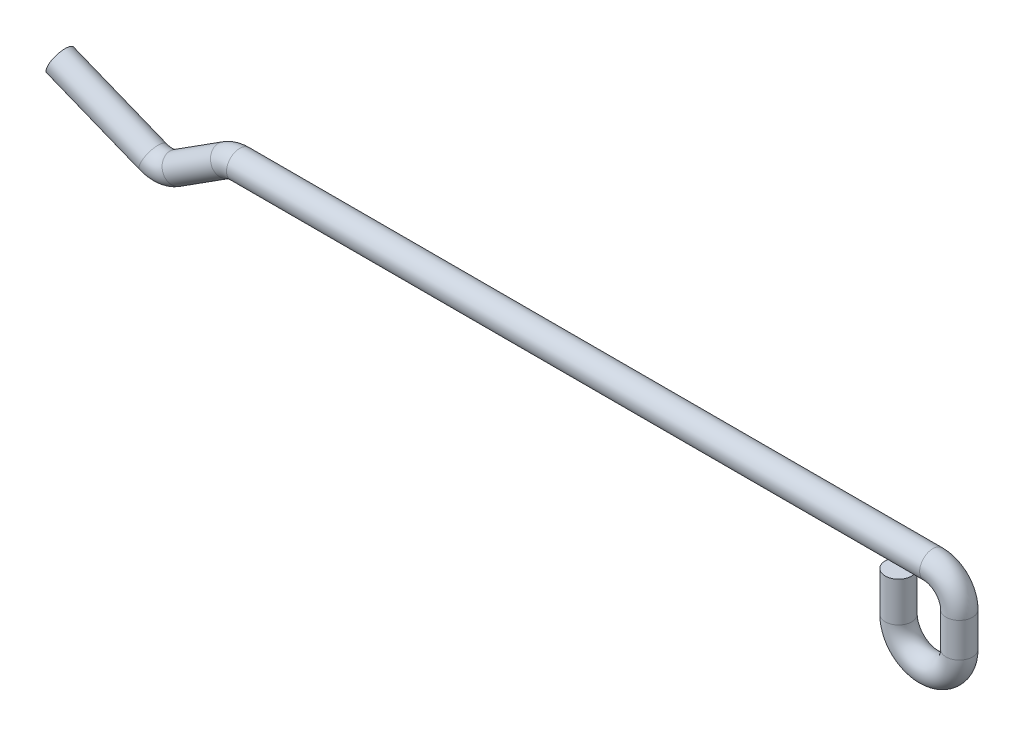
ISO-10303-21;
HEADER;
FILE_DESCRIPTION(('STEP AP214'),'2;1');
FILE_NAME('part.step','',(''),(''),'','','');
FILE_SCHEMA(('AUTOMOTIVE_DESIGN { 1 0 10303 214 1 1 1 1 }'));
ENDSEC;
DATA;
#1=APPLICATION_CONTEXT('core data for automotive mechanical design processes');
#2=APPLICATION_PROTOCOL_DEFINITION('international standard','automotive_design',2000,#1);
#3=PRODUCT_CONTEXT('',#1,'mechanical');
#4=PRODUCT('Part','Part','',(#3));
#5=PRODUCT_RELATED_PRODUCT_CATEGORY('part','',(#4));
#6=PRODUCT_DEFINITION_FORMATION('','',#4);
#7=PRODUCT_DEFINITION_CONTEXT('part definition',#1,'design');
#8=PRODUCT_DEFINITION('design','',#6,#7);
#9=PRODUCT_DEFINITION_SHAPE('','',#8);
#10=(LENGTH_UNIT() NAMED_UNIT(*) SI_UNIT(.MILLI.,.METRE.));
#11=(NAMED_UNIT(*) PLANE_ANGLE_UNIT() SI_UNIT($,.RADIAN.));
#12=(NAMED_UNIT(*) SI_UNIT($,.STERADIAN.) SOLID_ANGLE_UNIT());
#13=UNCERTAINTY_MEASURE_WITH_UNIT(LENGTH_MEASURE(1.E-05),#10,'distance_accuracy_value','');
#14=(GEOMETRIC_REPRESENTATION_CONTEXT(3) GLOBAL_UNCERTAINTY_ASSIGNED_CONTEXT((#13)) GLOBAL_UNIT_ASSIGNED_CONTEXT((#10,
#11,#12)) REPRESENTATION_CONTEXT('',''));
#15=CARTESIAN_POINT('',(0.,0.,0.));
#16=DIRECTION('',(0.,0.,1.));
#17=DIRECTION('',(1.,0.,0.));
#18=AXIS2_PLACEMENT_3D('',#15,#16,#17);
#19=CARTESIAN_POINT('',(-56.3710232392201,-1.2177613136877,0.));
#20=DIRECTION('',(-0.928195443882563,0.372093023255814,0.));
#21=DIRECTION('',(-0.372093023255814,-0.928195443882563,0.));
#22=AXIS2_PLACEMENT_3D('',#19,#20,#21);
#23=CYLINDRICAL_SURFACE('',#22,1.);
#24=CARTESIAN_POINT('',(-56.3710232392201,-1.2177613136877,0.));
#25=DIRECTION('',(0.928195443882568,-0.372093023255802,0.));
#26=DIRECTION('',(0.,0.,1.));
#27=AXIS2_PLACEMENT_3D('',#24,#25,#26);
#28=CIRCLE('',#27,1.);
#29=CARTESIAN_POINT('',(-56.7431162624759,-2.14595675757027,0.));
#30=VERTEX_POINT('',#29);
#31=EDGE_CURVE('E40',#30,#30,#28,.T.);
#32=CARTESIAN_POINT('',(-63.4,1.6,0.));
#33=DIRECTION('',(0.928195443882568,-0.372093023255802,0.));
#34=DIRECTION('',(0.,0.,1.));
#35=AXIS2_PLACEMENT_3D('',#32,#33,#34);
#36=CIRCLE('',#35,1.);
#37=CARTESIAN_POINT('',(-63.7720930232558,0.671804556117432,0.));
#38=VERTEX_POINT('',#37);
#39=EDGE_CURVE('E10',#38,#38,#36,.T.);
#40=CARTESIAN_POINT('',(-56.7431162624759,-2.14595675757027,0.));
#41=CARTESIAN_POINT('',(-56.8163347704007,-2.11660507721935,0.));
#42=CARTESIAN_POINT('',(-56.8895532783255,-2.08725339686844,0.));
#43=CARTESIAN_POINT('',(-57.0359902941751,-2.02855003616661,0.));
#44=CARTESIAN_POINT('',(-57.1092088020998,-1.9991983558157,0.));
#45=CARTESIAN_POINT('',(-57.2556458179494,-1.94049499511387,0.));
#46=CARTESIAN_POINT('',(-57.3288643258742,-1.91114331476296,0.));
#47=CARTESIAN_POINT('',(-57.4753013417238,-1.85243995406113,0.));
#48=CARTESIAN_POINT('',(-57.5485198496486,-1.82308827371022,0.));
#49=CARTESIAN_POINT('',(-57.6949568654982,-1.76438491300839,0.));
#50=CARTESIAN_POINT('',(-57.768175373423,-1.73503323265748,0.));
#51=CARTESIAN_POINT('',(-57.9146123892726,-1.67632987195565,0.));
#52=CARTESIAN_POINT('',(-57.9878308971973,-1.64697819160474,0.));
#53=CARTESIAN_POINT('',(-58.1342679130469,-1.58827483090291,0.));
#54=CARTESIAN_POINT('',(-58.2074864209717,-1.55892315055199,0.));
#55=CARTESIAN_POINT('',(-58.3539234368213,-1.50021978985017,0.));
#56=CARTESIAN_POINT('',(-58.4271419447461,-1.47086810949926,0.));
#57=CARTESIAN_POINT('',(-58.5735789605957,-1.41216474879743,0.));
#58=CARTESIAN_POINT('',(-58.6467974685205,-1.38281306844651,0.));
#59=CARTESIAN_POINT('',(-58.79323448437,-1.32410970774469,0.));
#60=CARTESIAN_POINT('',(-58.8664529922948,-1.29475802739377,0.));
#61=CARTESIAN_POINT('',(-59.0128900081444,-1.23605466669195,0.));
#62=CARTESIAN_POINT('',(-59.0861085160692,-1.20670298634103,0.));
#63=CARTESIAN_POINT('',(-59.2325455319188,-1.14799962563921,0.));
#64=CARTESIAN_POINT('',(-59.3057640398436,-1.11864794528829,0.));
#65=CARTESIAN_POINT('',(-59.4522010556932,-1.05994458458647,0.));
#66=CARTESIAN_POINT('',(-59.525419563618,-1.03059290423555,0.));
#67=CARTESIAN_POINT('',(-59.6718565794675,-0.971889543533725,0.));
#68=CARTESIAN_POINT('',(-59.7450750873923,-0.942537863182811,0.));
#69=CARTESIAN_POINT('',(-59.8915121032419,-0.883834502480984,0.));
#70=CARTESIAN_POINT('',(-59.9647306111667,-0.854482822130071,0.));
#71=CARTESIAN_POINT('',(-60.1111676270163,-0.795779461428244,0.));
#72=CARTESIAN_POINT('',(-60.1843861349411,-0.76642778107733,0.));
#73=CARTESIAN_POINT('',(-60.3308231507907,-0.707724420375503,0.));
#74=CARTESIAN_POINT('',(-60.4040416587154,-0.67837274002459,0.));
#75=CARTESIAN_POINT('',(-60.550478674565,-0.619669379322764,0.));
#76=CARTESIAN_POINT('',(-60.6236971824898,-0.590317698971849,0.));
#77=CARTESIAN_POINT('',(-60.7701341983394,-0.531614338270022,0.));
#78=CARTESIAN_POINT('',(-60.8433527062642,-0.502262657919108,0.));
#79=CARTESIAN_POINT('',(-60.9897897221138,-0.443559297217282,0.));
#80=CARTESIAN_POINT('',(-61.0630082300386,-0.414207616866369,0.));
#81=CARTESIAN_POINT('',(-61.2094452458882,-0.355504256164542,0.));
#82=CARTESIAN_POINT('',(-61.2826637538129,-0.326152575813627,0.));
#83=CARTESIAN_POINT('',(-61.4291007696625,-0.2674492151118,0.));
#84=CARTESIAN_POINT('',(-61.5023192775873,-0.238097534760888,0.));
#85=CARTESIAN_POINT('',(-61.6487562934369,-0.179394174059061,0.));
#86=CARTESIAN_POINT('',(-61.7219748013617,-0.150042493708146,0.));
#87=CARTESIAN_POINT('',(-61.8684118172113,-0.0913391330063192,0.));
#88=CARTESIAN_POINT('',(-61.9416303251361,-0.0619874526554063,0.));
#89=CARTESIAN_POINT('',(-62.0880673409856,-0.00328409195357959,0.));
#90=CARTESIAN_POINT('',(-62.1612858489104,0.0260675883973342,0.));
#91=CARTESIAN_POINT('',(-62.30772286476,0.0847709490991613,0.));
#92=CARTESIAN_POINT('',(-62.3809413726848,0.114122629450075,0.));
#93=CARTESIAN_POINT('',(-62.5273783885344,0.172825990151902,0.));
#94=CARTESIAN_POINT('',(-62.6005968964592,0.202177670502817,0.));
#95=CARTESIAN_POINT('',(-62.7470339123088,0.260881031204643,0.));
#96=CARTESIAN_POINT('',(-62.8202524202336,0.290232711555555,0.));
#97=CARTESIAN_POINT('',(-62.9666894360831,0.348936072257382,0.));
#98=CARTESIAN_POINT('',(-63.0399079440079,0.378287752608296,0.));
#99=CARTESIAN_POINT('',(-63.1863449598575,0.436991113310124,0.));
#100=CARTESIAN_POINT('',(-63.2595634677823,0.466342793661037,0.));
#101=CARTESIAN_POINT('',(-63.4060004836319,0.525046154362864,0.));
#102=CARTESIAN_POINT('',(-63.4792189915567,0.554397834713778,0.));
#103=CARTESIAN_POINT('',(-63.6256560074062,0.613101195415605,0.));
#104=CARTESIAN_POINT('',(-63.698874515331,0.642452875766518,0.));
#105=CARTESIAN_POINT('',(-63.7720930232558,0.671804556117432,0.));
#106=B_SPLINE_CURVE_WITH_KNOTS('',3,(#40,#41,#42,#43,#44,#45,#46,#47,#48,#49,#50,#51,#52,#53,
#54,#55,#56,#57,#58,#59,#60,#61,#62,#63,#64,#65,#66,#67,#68,#69,#70,#71,#72,#73,#74,#75,#76,#77,
#78,#79,#80,#81,#82,#83,#84,#85,#86,#87,#88,#89,#90,#91,#92,#93,#94,#95,#96,#97,#98,#99,#100,
#101,#102,#103,#104,#105),.UNSPECIFIED.,.F.,.F.,(4,2,2,2,2,2,2,2,2,2,2,2,2,2,2,2,2,2,2,2,2,2,2,
2,2,2,2,2,2,2,2,2,4),(0.,0.236647922829238,0.473295845658475,0.709943768487719,
0.946591691316957,1.1832396141462,1.41988753697544,1.65653545980468,1.89318338263392,
2.12983130546316,2.3664792282924,2.60312715112164,2.83977507395088,3.07642299678012,
3.31307091960936,3.5497188424386,3.78636676526784,4.02301468809708,4.25966261092632,
4.49631053375556,4.7329584565848,4.96960637941404,5.20625430224328,5.44290222507252,
5.67955014790176,5.916198070731,6.15284599356024,6.38949391638948,6.62614183921873,
6.86278976204797,7.0994376848772,7.33608560770644,7.57273353053568),.UNSPECIFIED.);
#107=EDGE_CURVE('BSEAM34',#30,#38,#106,.T.);
#108=ORIENTED_EDGE('',*,*,#31,.F.);
#109=ORIENTED_EDGE('',*,*,#39,.T.);
#110=ORIENTED_EDGE('',*,*,#107,.T.);
#111=ORIENTED_EDGE('',*,*,#107,.F.);
#112=EDGE_LOOP('',(#108,#110,#109,#111));
#113=FACE_BOUND('',#112,.T.);
#114=ADVANCED_FACE('F34',(#113),#23,.T.);
#115=CARTESIAN_POINT('',(-55.6268371927084,0.638629574077423,0.));
#116=DIRECTION('',(0.,0.,-1.));
#117=DIRECTION('',(-1.,0.,0.));
#118=AXIS2_PLACEMENT_3D('',#115,#116,#117);
#119=TOROIDAL_SURFACE('',#118,2.,1.);
#120=CARTESIAN_POINT('',(-54.5514043560066,-1.04762195334767,0.));
#121=DIRECTION('',(0.843125763712528,0.537716418350942,0.));
#122=DIRECTION('',(0.,0.,1.));
#123=AXIS2_PLACEMENT_3D('',#120,#121,#122);
#124=CIRCLE('',#123,1.);
#125=CARTESIAN_POINT('',(-54.0136879376557,-1.89074771706021,0.));
#126=VERTEX_POINT('',#125);
#127=EDGE_CURVE('E44',#126,#126,#124,.T.);
#128=CARTESIAN_POINT('',(-55.6268371927084,0.638629574077423,0.));
#129=DIRECTION('',(0.,0.,-1.));
#130=DIRECTION('',(-1.,0.,0.));
#131=AXIS2_PLACEMENT_3D('',#128,#129,#130);
#132=CIRCLE('',#131,3.);
#133=EDGE_CURVE('',#126,#30,#132,.T.);
#134=ORIENTED_EDGE('',*,*,#127,.F.);
#135=ORIENTED_EDGE('',*,*,#31,.T.);
#136=ORIENTED_EDGE('',*,*,#133,.T.);
#137=ORIENTED_EDGE('',*,*,#133,.F.);
#138=EDGE_LOOP('',(#134,#136,#135,#137));
#139=FACE_BOUND('',#138,.T.);
#140=ADVANCED_FACE('F108',(#139),#119,.T.);
#141=CARTESIAN_POINT('',(-50.8919496811435,1.28625152742505,0.));
#142=DIRECTION('',(-0.843125763712536,-0.53771641835093,0.));
#143=DIRECTION('',(0.53771641835093,-0.843125763712537,0.));
#144=AXIS2_PLACEMENT_3D('',#141,#142,#143);
#145=CYLINDRICAL_SURFACE('',#144,1.);
#146=CARTESIAN_POINT('',(-50.8919496811435,1.28625152742505,0.));
#147=DIRECTION('',(0.843125763712528,0.537716418350942,0.));
#148=DIRECTION('',(0.,0.,1.));
#149=AXIS2_PLACEMENT_3D('',#146,#147,#148);
#150=CIRCLE('',#149,1.);
#151=CARTESIAN_POINT('',(-51.4296660994945,2.12937729113758,0.));
#152=VERTEX_POINT('',#151);
#153=EDGE_CURVE('E48',#152,#152,#150,.T.);
#154=ORIENTED_EDGE('',*,*,#153,.F.);
#155=EDGE_LOOP('',(#154));
#156=FACE_BOUND('',#155,.T.);
#157=ORIENTED_EDGE('',*,*,#127,.T.);
#158=EDGE_LOOP('',(#157));
#159=FACE_BOUND('',#158,.T.);
#160=ADVANCED_FACE('F102',(#156,#159),#145,.T.);
#161=CARTESIAN_POINT('',(-49.8165168444417,-0.400000000000007,0.));
#162=DIRECTION('',(0.,0.,1.));
#163=DIRECTION('',(1.,0.,0.));
#164=AXIS2_PLACEMENT_3D('',#161,#162,#163);
#165=TOROIDAL_SURFACE('',#164,2.,1.);
#166=CARTESIAN_POINT('',(-49.8165168444417,1.59999999999999,0.));
#167=DIRECTION('',(1.,0.,0.));
#168=DIRECTION('',(0.,0.,1.));
#169=AXIS2_PLACEMENT_3D('',#166,#167,#168);
#170=CIRCLE('',#169,1.);
#171=CARTESIAN_POINT('',(-49.8165168444417,2.59999999999999,0.));
#172=VERTEX_POINT('',#171);
#173=EDGE_CURVE('E53',#172,#172,#170,.T.);
#174=CARTESIAN_POINT('',(-49.8165168444417,-0.400000000000007,0.));
#175=DIRECTION('',(0.,0.,1.));
#176=DIRECTION('',(1.,0.,0.));
#177=AXIS2_PLACEMENT_3D('',#174,#175,#176);
#178=CIRCLE('',#177,3.);
#179=EDGE_CURVE('',#172,#152,#178,.T.);
#180=ORIENTED_EDGE('',*,*,#173,.F.);
#181=ORIENTED_EDGE('',*,*,#153,.T.);
#182=ORIENTED_EDGE('',*,*,#179,.T.);
#183=ORIENTED_EDGE('',*,*,#179,.F.);
#184=EDGE_LOOP('',(#180,#182,#181,#183));
#185=FACE_BOUND('',#184,.T.);
#186=ADVANCED_FACE('F96',(#185),#165,.T.);
#187=CARTESIAN_POINT('',(2.59999999999997,1.6,0.));
#188=DIRECTION('',(-1.,0.,0.));
#189=DIRECTION('',(0.,-1.,0.));
#190=AXIS2_PLACEMENT_3D('',#187,#188,#189);
#191=CYLINDRICAL_SURFACE('',#190,1.);
#192=CARTESIAN_POINT('',(2.59999999999997,1.6,0.));
#193=DIRECTION('',(1.,0.,0.));
#194=DIRECTION('',(0.,0.,1.));
#195=AXIS2_PLACEMENT_3D('',#192,#193,#194);
#196=CIRCLE('',#195,1.);
#197=CARTESIAN_POINT('',(2.59999999999995,2.6,0.));
#198=VERTEX_POINT('',#197);
#199=EDGE_CURVE('E56',#198,#198,#196,.T.);
#200=ORIENTED_EDGE('',*,*,#199,.F.);
#201=EDGE_LOOP('',(#200));
#202=FACE_BOUND('',#201,.T.);
#203=ORIENTED_EDGE('',*,*,#173,.T.);
#204=EDGE_LOOP('',(#203));
#205=FACE_BOUND('',#204,.T.);
#206=ADVANCED_FACE('F90',(#202,#205),#191,.T.);
#207=CARTESIAN_POINT('',(2.6,-0.4,0.));
#208=DIRECTION('',(0.,0.,1.));
#209=DIRECTION('',(1.,0.,0.));
#210=AXIS2_PLACEMENT_3D('',#207,#208,#209);
#211=TOROIDAL_SURFACE('',#210,2.,1.);
#212=CARTESIAN_POINT('',(4.6,-0.399999999999969,0.));
#213=DIRECTION('',(0.,-1.,0.));
#214=DIRECTION('',(0.,0.,1.));
#215=AXIS2_PLACEMENT_3D('',#212,#213,#214);
#216=CIRCLE('',#215,1.);
#217=CARTESIAN_POINT('',(5.6,-0.399999999999953,0.));
#218=VERTEX_POINT('',#217);
#219=EDGE_CURVE('E59',#218,#218,#216,.T.);
#220=CARTESIAN_POINT('',(2.6,-0.4,0.));
#221=DIRECTION('',(0.,0.,1.));
#222=DIRECTION('',(1.,0.,0.));
#223=AXIS2_PLACEMENT_3D('',#220,#221,#222);
#224=CIRCLE('',#223,3.);
#225=EDGE_CURVE('',#218,#198,#224,.T.);
#226=ORIENTED_EDGE('',*,*,#219,.F.);
#227=ORIENTED_EDGE('',*,*,#199,.T.);
#228=ORIENTED_EDGE('',*,*,#225,.T.);
#229=ORIENTED_EDGE('',*,*,#225,.F.);
#230=EDGE_LOOP('',(#226,#228,#227,#229));
#231=FACE_BOUND('',#230,.T.);
#232=ADVANCED_FACE('F84',(#231),#211,.T.);
#233=CARTESIAN_POINT('',(4.6,-2.99999999999997,0.));
#234=DIRECTION('',(0.,1.,0.));
#235=DIRECTION('',(0.,0.,1.));
#236=AXIS2_PLACEMENT_3D('',#233,#234,#235);
#237=CYLINDRICAL_SURFACE('',#236,1.);
#238=CARTESIAN_POINT('',(4.6,-2.99999999999997,0.));
#239=DIRECTION('',(0.,-1.,0.));
#240=DIRECTION('',(0.,0.,1.));
#241=AXIS2_PLACEMENT_3D('',#238,#239,#240);
#242=CIRCLE('',#241,1.);
#243=CARTESIAN_POINT('',(5.6,-2.99999999999995,0.));
#244=VERTEX_POINT('',#243);
#245=EDGE_CURVE('E62',#244,#244,#242,.T.);
#246=ORIENTED_EDGE('',*,*,#245,.F.);
#247=EDGE_LOOP('',(#246));
#248=FACE_BOUND('',#247,.T.);
#249=ORIENTED_EDGE('',*,*,#219,.T.);
#250=EDGE_LOOP('',(#249));
#251=FACE_BOUND('',#250,.T.);
#252=ADVANCED_FACE('F78',(#248,#251),#237,.T.);
#253=CARTESIAN_POINT('',(2.3,-3.,0.));
#254=DIRECTION('',(0.,0.,1.));
#255=DIRECTION('',(1.,0.,0.));
#256=AXIS2_PLACEMENT_3D('',#253,#254,#255);
#257=TOROIDAL_SURFACE('',#256,2.3,1.);
#258=CARTESIAN_POINT('',(0.,-3.,0.));
#259=DIRECTION('',(0.,1.,0.));
#260=DIRECTION('',(0.,0.,1.));
#261=AXIS2_PLACEMENT_3D('',#258,#259,#260);
#262=CIRCLE('',#261,1.);
#263=CARTESIAN_POINT('',(-1.,-3.,0.));
#264=VERTEX_POINT('',#263);
#265=EDGE_CURVE('E65',#264,#264,#262,.T.);
#266=CARTESIAN_POINT('',(2.3,-3.,0.));
#267=DIRECTION('',(0.,0.,1.));
#268=DIRECTION('',(1.,0.,0.));
#269=AXIS2_PLACEMENT_3D('',#266,#267,#268);
#270=CIRCLE('',#269,3.3);
#271=EDGE_CURVE('',#264,#244,#270,.T.);
#272=ORIENTED_EDGE('',*,*,#265,.F.);
#273=ORIENTED_EDGE('',*,*,#245,.T.);
#274=ORIENTED_EDGE('',*,*,#271,.T.);
#275=ORIENTED_EDGE('',*,*,#271,.F.);
#276=EDGE_LOOP('',(#272,#274,#273,#275));
#277=FACE_BOUND('',#276,.T.);
#278=ADVANCED_FACE('F75',(#277),#257,.T.);
#279=CARTESIAN_POINT('',(0.,-3.,0.));
#280=DIRECTION('',(0.,1.,0.));
#281=DIRECTION('',(0.,0.,1.));
#282=AXIS2_PLACEMENT_3D('',#279,#280,#281);
#283=CYLINDRICAL_SURFACE('',#282,1.);
#284=ORIENTED_EDGE('',*,*,#265,.T.);
#285=EDGE_LOOP('',(#284));
#286=FACE_BOUND('',#285,.T.);
#287=CARTESIAN_POINT('',(0.,0.,0.));
#288=DIRECTION('',(0.,1.,0.));
#289=DIRECTION('',(0.,0.,1.));
#290=AXIS2_PLACEMENT_3D('',#287,#288,#289);
#291=CIRCLE('',#290,1.);
#292=CARTESIAN_POINT('',(0.,0.,1.));
#293=VERTEX_POINT('',#292);
#294=EDGE_CURVE('E66',#293,#293,#291,.T.);
#295=ORIENTED_EDGE('',*,*,#294,.F.);
#296=EDGE_LOOP('',(#295));
#297=FACE_BOUND('',#296,.T.);
#298=ADVANCED_FACE('F72',(#286,#297),#283,.T.);
#299=CARTESIAN_POINT('',(-63.4,1.6,0.));
#300=DIRECTION('',(0.928195443882568,-0.372093023255802,0.));
#301=DIRECTION('',(0.,0.,1.));
#302=AXIS2_PLACEMENT_3D('',#299,#300,#301);
#303=PLANE('',#302);
#304=ORIENTED_EDGE('',*,*,#39,.F.);
#305=EDGE_LOOP('',(#304));
#306=FACE_BOUND('',#305,.T.);
#307=ADVANCED_FACE('F120',(#306),#303,.F.);
#308=CARTESIAN_POINT('',(0.,0.,0.));
#309=DIRECTION('',(0.,1.,0.));
#310=DIRECTION('',(0.,0.,1.));
#311=AXIS2_PLACEMENT_3D('',#308,#309,#310);
#312=PLANE('',#311);
#313=ORIENTED_EDGE('',*,*,#294,.T.);
#314=EDGE_LOOP('',(#313));
#315=FACE_BOUND('',#314,.T.);
#316=ADVANCED_FACE('F121',(#315),#312,.T.);
#317=CLOSED_SHELL('',(#114,#140,#160,#186,#206,#232,#252,#278,#298,#307,#316));
#318=MANIFOLD_SOLID_BREP('B2',#317);
#319=ADVANCED_BREP_SHAPE_REPRESENTATION('',(#18,#318),#14);
#320=SHAPE_DEFINITION_REPRESENTATION(#9,#319);
ENDSEC;
END-ISO-10303-21;
